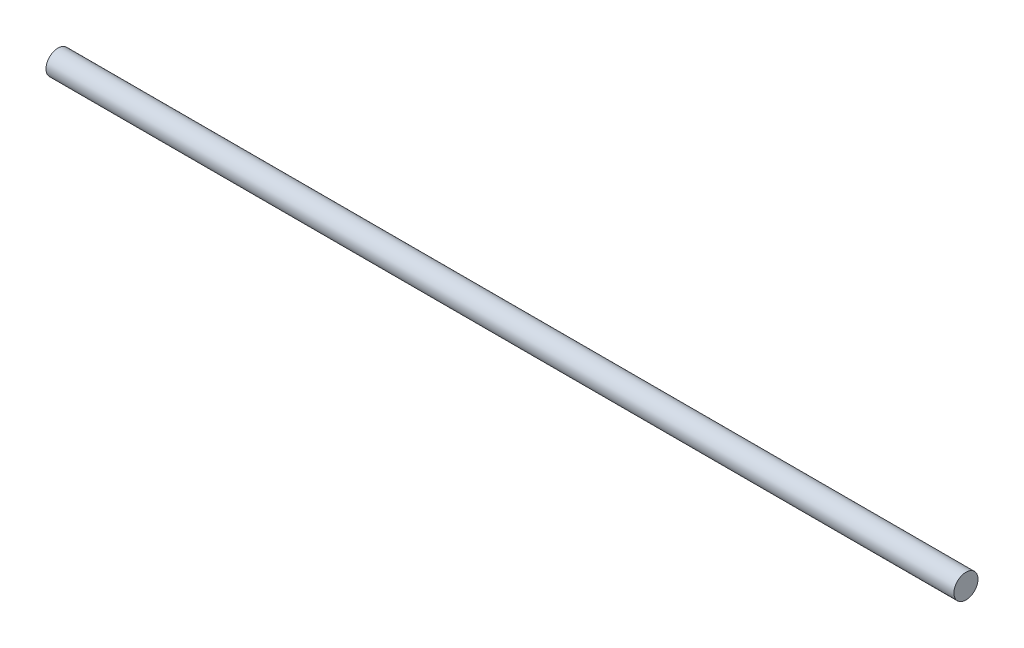
ISO-10303-21;
HEADER;
FILE_DESCRIPTION(('STEP AP214'),'2;1');
FILE_NAME('part.step','',(''),(''),'','','');
FILE_SCHEMA(('AUTOMOTIVE_DESIGN { 1 0 10303 214 1 1 1 1 }'));
ENDSEC;
DATA;
#1=APPLICATION_CONTEXT('core data for automotive mechanical design processes');
#2=APPLICATION_PROTOCOL_DEFINITION('international standard','automotive_design',2000,#1);
#3=PRODUCT_CONTEXT('',#1,'mechanical');
#4=PRODUCT('Part','Part','',(#3));
#5=PRODUCT_RELATED_PRODUCT_CATEGORY('part','',(#4));
#6=PRODUCT_DEFINITION_FORMATION('','',#4);
#7=PRODUCT_DEFINITION_CONTEXT('part definition',#1,'design');
#8=PRODUCT_DEFINITION('design','',#6,#7);
#9=PRODUCT_DEFINITION_SHAPE('','',#8);
#10=(LENGTH_UNIT() NAMED_UNIT(*) SI_UNIT(.MILLI.,.METRE.));
#11=(NAMED_UNIT(*) PLANE_ANGLE_UNIT() SI_UNIT($,.RADIAN.));
#12=(NAMED_UNIT(*) SI_UNIT($,.STERADIAN.) SOLID_ANGLE_UNIT());
#13=UNCERTAINTY_MEASURE_WITH_UNIT(LENGTH_MEASURE(1.E-05),#10,'distance_accuracy_value','');
#14=(GEOMETRIC_REPRESENTATION_CONTEXT(3) GLOBAL_UNCERTAINTY_ASSIGNED_CONTEXT((#13)) GLOBAL_UNIT_ASSIGNED_CONTEXT((#10,
#11,#12)) REPRESENTATION_CONTEXT('',''));
#15=CARTESIAN_POINT('',(0.,0.,0.));
#16=DIRECTION('',(0.,0.,1.));
#17=DIRECTION('',(1.,0.,0.));
#18=AXIS2_PLACEMENT_3D('',#15,#16,#17);
#19=CARTESIAN_POINT('',(-53.,0.,0.));
#20=DIRECTION('',(1.,0.,0.));
#21=DIRECTION('',(0.,0.,-1.));
#22=AXIS2_PLACEMENT_3D('',#19,#20,#21);
#23=CYLINDRICAL_SURFACE('',#22,1.5);
#24=CARTESIAN_POINT('',(-53.,0.,0.));
#25=DIRECTION('',(1.,0.,0.));
#26=DIRECTION('',(0.,0.,-1.));
#27=AXIS2_PLACEMENT_3D('',#24,#25,#26);
#28=CIRCLE('',#27,1.5);
#29=CARTESIAN_POINT('',(-53.,0.,-1.5));
#30=VERTEX_POINT('',#29);
#31=EDGE_CURVE('E10',#30,#30,#28,.T.);
#32=ORIENTED_EDGE('',*,*,#31,.T.);
#33=EDGE_LOOP('',(#32));
#34=FACE_BOUND('',#33,.T.);
#35=CARTESIAN_POINT('',(60.,0.,0.));
#36=DIRECTION('',(1.,0.,0.));
#37=DIRECTION('',(0.,0.,-1.));
#38=AXIS2_PLACEMENT_3D('',#35,#36,#37);
#39=CIRCLE('',#38,1.5);
#40=CARTESIAN_POINT('',(60.,0.,-1.5));
#41=VERTEX_POINT('',#40);
#42=EDGE_CURVE('E34',#41,#41,#39,.T.);
#43=ORIENTED_EDGE('',*,*,#42,.F.);
#44=EDGE_LOOP('',(#43));
#45=FACE_BOUND('',#44,.T.);
#46=ADVANCED_FACE('F28',(#34,#45),#23,.T.);
#47=CARTESIAN_POINT('',(-53.,0.,0.));
#48=DIRECTION('',(1.,0.,0.));
#49=DIRECTION('',(0.,0.,-1.));
#50=AXIS2_PLACEMENT_3D('',#47,#48,#49);
#51=PLANE('',#50);
#52=ORIENTED_EDGE('',*,*,#31,.F.);
#53=EDGE_LOOP('',(#52));
#54=FACE_BOUND('',#53,.T.);
#55=ADVANCED_FACE('F43',(#54),#51,.F.);
#56=CARTESIAN_POINT('',(60.,0.,0.));
#57=DIRECTION('',(1.,0.,0.));
#58=DIRECTION('',(0.,0.,-1.));
#59=AXIS2_PLACEMENT_3D('',#56,#57,#58);
#60=PLANE('',#59);
#61=ORIENTED_EDGE('',*,*,#42,.T.);
#62=EDGE_LOOP('',(#61));
#63=FACE_BOUND('',#62,.T.);
#64=ADVANCED_FACE('F40',(#63),#60,.T.);
#65=CLOSED_SHELL('',(#46,#55,#64));
#66=MANIFOLD_SOLID_BREP('B2',#65);
#67=ADVANCED_BREP_SHAPE_REPRESENTATION('',(#18,#66),#14);
#68=SHAPE_DEFINITION_REPRESENTATION(#9,#67);
ENDSEC;
END-ISO-10303-21;
